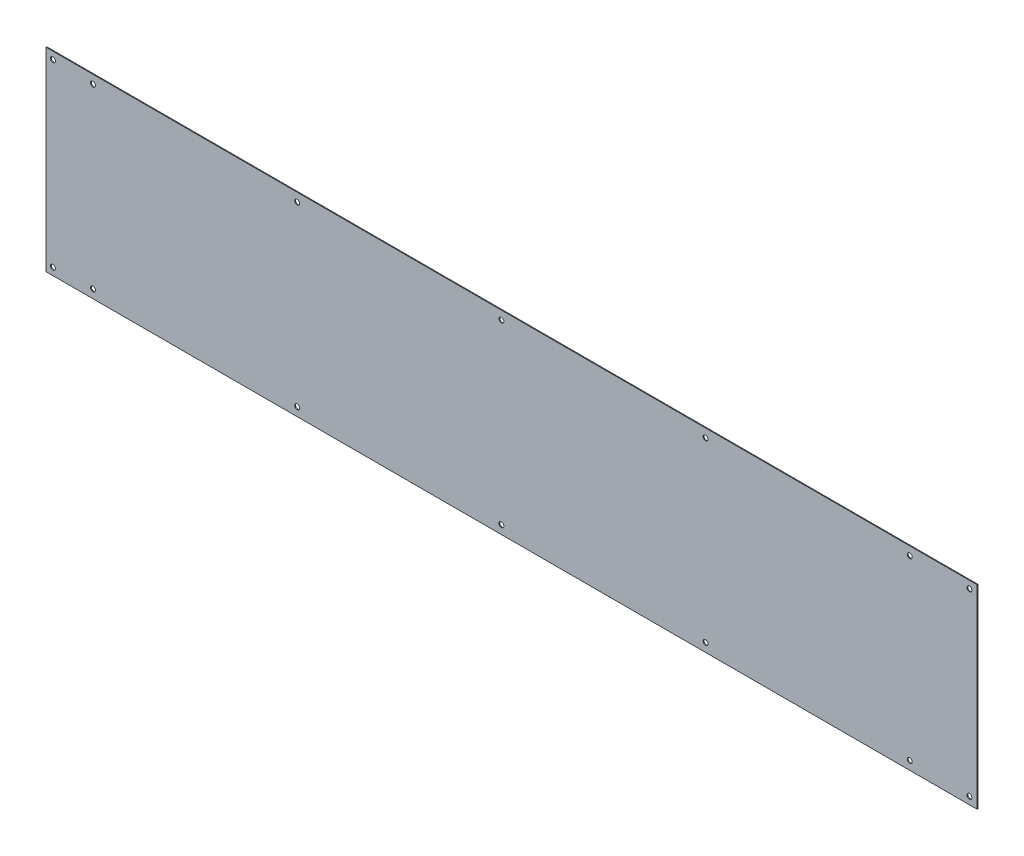
ISO-10303-21;
HEADER;
FILE_DESCRIPTION(('STEP AP214'),'2;1');
FILE_NAME('part.step','',(''),(''),'','','');
FILE_SCHEMA(('AUTOMOTIVE_DESIGN { 1 0 10303 214 1 1 1 1 }'));
ENDSEC;
DATA;
#1=APPLICATION_CONTEXT('core data for automotive mechanical design processes');
#2=APPLICATION_PROTOCOL_DEFINITION('international standard','automotive_design',2000,#1);
#3=PRODUCT_CONTEXT('',#1,'mechanical');
#4=PRODUCT('Part','Part','',(#3));
#5=PRODUCT_RELATED_PRODUCT_CATEGORY('part','',(#4));
#6=PRODUCT_DEFINITION_FORMATION('','',#4);
#7=PRODUCT_DEFINITION_CONTEXT('part definition',#1,'design');
#8=PRODUCT_DEFINITION('design','',#6,#7);
#9=PRODUCT_DEFINITION_SHAPE('','',#8);
#10=(LENGTH_UNIT() NAMED_UNIT(*) SI_UNIT(.MILLI.,.METRE.));
#11=(NAMED_UNIT(*) PLANE_ANGLE_UNIT() SI_UNIT($,.RADIAN.));
#12=(NAMED_UNIT(*) SI_UNIT($,.STERADIAN.) SOLID_ANGLE_UNIT());
#13=UNCERTAINTY_MEASURE_WITH_UNIT(LENGTH_MEASURE(1.E-05),#10,'distance_accuracy_value','');
#14=(GEOMETRIC_REPRESENTATION_CONTEXT(3) GLOBAL_UNCERTAINTY_ASSIGNED_CONTEXT((#13)) GLOBAL_UNIT_ASSIGNED_CONTEXT((#10,
#11,#12)) REPRESENTATION_CONTEXT('',''));
#15=CARTESIAN_POINT('',(0.,0.,0.));
#16=DIRECTION('',(0.,0.,1.));
#17=DIRECTION('',(1.,0.,0.));
#18=AXIS2_PLACEMENT_3D('',#15,#16,#17);
#19=CARTESIAN_POINT('',(570.,119.,-1.));
#20=DIRECTION('',(1.,0.,0.));
#21=DIRECTION('',(0.,0.,-1.));
#22=AXIS2_PLACEMENT_3D('',#19,#20,#21);
#23=PLANE('',#22);
#24=DIRECTION('',(0.,1.,0.));
#25=VECTOR('',#24,1.);
#26=CARTESIAN_POINT('',(570.,119.,0.));
#27=LINE('',#26,#25);
#28=CARTESIAN_POINT('',(570.,-119.,0.));
#29=VERTEX_POINT('',#28);
#30=CARTESIAN_POINT('',(570.,119.,0.));
#31=VERTEX_POINT('',#30);
#32=EDGE_CURVE('E99',#29,#31,#27,.T.);
#33=ORIENTED_EDGE('',*,*,#32,.F.);
#34=DIRECTION('',(0.,0.,1.));
#35=VECTOR('',#34,1.);
#36=CARTESIAN_POINT('',(570.,-119.,-1.));
#37=LINE('',#36,#35);
#38=CARTESIAN_POINT('',(570.,-119.,-1.));
#39=VERTEX_POINT('',#38);
#40=EDGE_CURVE('E11',#39,#29,#37,.T.);
#41=ORIENTED_EDGE('',*,*,#40,.F.);
#42=DIRECTION('',(0.,1.,0.));
#43=VECTOR('',#42,1.);
#44=CARTESIAN_POINT('',(570.,119.,-1.));
#45=LINE('',#44,#43);
#46=CARTESIAN_POINT('',(570.,119.,-1.));
#47=VERTEX_POINT('',#46);
#48=EDGE_CURVE('E92',#39,#47,#45,.T.);
#49=ORIENTED_EDGE('',*,*,#48,.T.);
#50=DIRECTION('',(0.,0.,1.));
#51=VECTOR('',#50,1.);
#52=CARTESIAN_POINT('',(570.,119.,-1.));
#53=LINE('',#52,#51);
#54=EDGE_CURVE('E37',#47,#31,#53,.T.);
#55=ORIENTED_EDGE('',*,*,#54,.T.);
#56=EDGE_LOOP('',(#33,#41,#49,#55));
#57=FACE_BOUND('',#56,.T.);
#58=ADVANCED_FACE('F34',(#57),#23,.T.);
#59=CARTESIAN_POINT('',(-570.,-119.,-1.));
#60=DIRECTION('',(0.,-1.,0.));
#61=DIRECTION('',(0.,0.,-1.));
#62=AXIS2_PLACEMENT_3D('',#59,#60,#61);
#63=PLANE('',#62);
#64=DIRECTION('',(1.,0.,0.));
#65=VECTOR('',#64,1.);
#66=CARTESIAN_POINT('',(-570.,-119.,0.));
#67=LINE('',#66,#65);
#68=CARTESIAN_POINT('',(-570.,-119.,0.));
#69=VERTEX_POINT('',#68);
#70=EDGE_CURVE('E94',#69,#29,#67,.T.);
#71=ORIENTED_EDGE('',*,*,#70,.F.);
#72=DIRECTION('',(0.,0.,1.));
#73=VECTOR('',#72,1.);
#74=CARTESIAN_POINT('',(-570.,-119.,-1.));
#75=LINE('',#74,#73);
#76=CARTESIAN_POINT('',(-570.,-119.,-1.));
#77=VERTEX_POINT('',#76);
#78=EDGE_CURVE('E43',#77,#69,#75,.T.);
#79=ORIENTED_EDGE('',*,*,#78,.F.);
#80=DIRECTION('',(1.,0.,0.));
#81=VECTOR('',#80,1.);
#82=CARTESIAN_POINT('',(-570.,-119.,-1.));
#83=LINE('',#82,#81);
#84=EDGE_CURVE('E89',#77,#39,#83,.T.);
#85=ORIENTED_EDGE('',*,*,#84,.T.);
#86=ORIENTED_EDGE('',*,*,#40,.T.);
#87=EDGE_LOOP('',(#71,#79,#85,#86));
#88=FACE_BOUND('',#87,.T.);
#89=ADVANCED_FACE('F110',(#88),#63,.T.);
#90=CARTESIAN_POINT('',(-570.,119.,-1.));
#91=DIRECTION('',(-1.,0.,0.));
#92=DIRECTION('',(0.,0.,1.));
#93=AXIS2_PLACEMENT_3D('',#90,#91,#92);
#94=PLANE('',#93);
#95=DIRECTION('',(0.,-1.,0.));
#96=VECTOR('',#95,1.);
#97=CARTESIAN_POINT('',(-570.,119.,0.));
#98=LINE('',#97,#96);
#99=CARTESIAN_POINT('',(-570.,119.,0.));
#100=VERTEX_POINT('',#99);
#101=EDGE_CURVE('E84',#100,#69,#98,.T.);
#102=ORIENTED_EDGE('',*,*,#101,.F.);
#103=DIRECTION('',(0.,0.,1.));
#104=VECTOR('',#103,1.);
#105=CARTESIAN_POINT('',(-570.,119.,-1.));
#106=LINE('',#105,#104);
#107=CARTESIAN_POINT('',(-570.,119.,-1.));
#108=VERTEX_POINT('',#107);
#109=EDGE_CURVE('E79',#108,#100,#106,.T.);
#110=ORIENTED_EDGE('',*,*,#109,.F.);
#111=DIRECTION('',(0.,-1.,0.));
#112=VECTOR('',#111,1.);
#113=CARTESIAN_POINT('',(-570.,119.,-1.));
#114=LINE('',#113,#112);
#115=EDGE_CURVE('E82',#108,#77,#114,.T.);
#116=ORIENTED_EDGE('',*,*,#115,.T.);
#117=ORIENTED_EDGE('',*,*,#78,.T.);
#118=EDGE_LOOP('',(#102,#110,#116,#117));
#119=FACE_BOUND('',#118,.T.);
#120=ADVANCED_FACE('F81',(#119),#94,.T.);
#121=CARTESIAN_POINT('',(-570.,119.,-1.));
#122=DIRECTION('',(0.,1.,0.));
#123=DIRECTION('',(0.,0.,1.));
#124=AXIS2_PLACEMENT_3D('',#121,#122,#123);
#125=PLANE('',#124);
#126=DIRECTION('',(-1.,0.,0.));
#127=VECTOR('',#126,1.);
#128=CARTESIAN_POINT('',(-570.,119.,0.));
#129=LINE('',#128,#127);
#130=EDGE_CURVE('E102',#31,#100,#129,.T.);
#131=ORIENTED_EDGE('',*,*,#130,.F.);
#132=ORIENTED_EDGE('',*,*,#54,.F.);
#133=DIRECTION('',(-1.,0.,0.));
#134=VECTOR('',#133,1.);
#135=CARTESIAN_POINT('',(-570.,119.,-1.));
#136=LINE('',#135,#134);
#137=EDGE_CURVE('E88',#47,#108,#136,.T.);
#138=ORIENTED_EDGE('',*,*,#137,.T.);
#139=ORIENTED_EDGE('',*,*,#109,.T.);
#140=EDGE_LOOP('',(#131,#132,#138,#139));
#141=FACE_BOUND('',#140,.T.);
#142=ADVANCED_FACE('F91',(#141),#125,.T.);
#143=CARTESIAN_POINT('',(570.,-119.,-1.));
#144=DIRECTION('',(0.,0.,1.));
#145=DIRECTION('',(1.,0.,0.));
#146=AXIS2_PLACEMENT_3D('',#143,#144,#145);
#147=PLANE('',#146);
#148=CARTESIAN_POINT('',(487.5,-108.5,-1.));
#149=DIRECTION('',(0.,0.,1.));
#150=DIRECTION('',(1.,0.,0.));
#151=AXIS2_PLACEMENT_3D('',#148,#149,#150);
#152=CIRCLE('',#151,2.99999999999999);
#153=CARTESIAN_POINT('',(490.5,-108.5,-1.));
#154=VERTEX_POINT('',#153);
#155=EDGE_CURVE('E194',#154,#154,#152,.F.);
#156=ORIENTED_EDGE('',*,*,#155,.F.);
#157=EDGE_LOOP('',(#156));
#158=FACE_BOUND('',#157,.T.);
#159=CARTESIAN_POINT('',(237.5,-108.5,-1.));
#160=DIRECTION('',(0.,0.,1.));
#161=DIRECTION('',(1.,0.,0.));
#162=AXIS2_PLACEMENT_3D('',#159,#160,#161);
#163=CIRCLE('',#162,2.99999999999999);
#164=CARTESIAN_POINT('',(240.5,-108.5,-1.));
#165=VERTEX_POINT('',#164);
#166=EDGE_CURVE('E198',#165,#165,#163,.F.);
#167=ORIENTED_EDGE('',*,*,#166,.F.);
#168=EDGE_LOOP('',(#167));
#169=FACE_BOUND('',#168,.T.);
#170=CARTESIAN_POINT('',(-12.5000000000002,-108.5,-1.));
#171=DIRECTION('',(0.,0.,1.));
#172=DIRECTION('',(1.,0.,0.));
#173=AXIS2_PLACEMENT_3D('',#170,#171,#172);
#174=CIRCLE('',#173,3.);
#175=CARTESIAN_POINT('',(-9.50000000000017,-108.5,-1.));
#176=VERTEX_POINT('',#175);
#177=EDGE_CURVE('E207',#176,#176,#174,.F.);
#178=ORIENTED_EDGE('',*,*,#177,.F.);
#179=EDGE_LOOP('',(#178));
#180=FACE_BOUND('',#179,.T.);
#181=CARTESIAN_POINT('',(-262.5,-108.5,-1.));
#182=DIRECTION('',(0.,0.,1.));
#183=DIRECTION('',(1.,0.,0.));
#184=AXIS2_PLACEMENT_3D('',#181,#182,#183);
#185=CIRCLE('',#184,2.99999999999999);
#186=CARTESIAN_POINT('',(-259.5,-108.5,-1.));
#187=VERTEX_POINT('',#186);
#188=EDGE_CURVE('E213',#187,#187,#185,.F.);
#189=ORIENTED_EDGE('',*,*,#188,.F.);
#190=EDGE_LOOP('',(#189));
#191=FACE_BOUND('',#190,.T.);
#192=CARTESIAN_POINT('',(-512.5,-108.5,-1.));
#193=DIRECTION('',(0.,0.,1.));
#194=DIRECTION('',(1.,0.,0.));
#195=AXIS2_PLACEMENT_3D('',#192,#193,#194);
#196=CIRCLE('',#195,3.00000000000005);
#197=CARTESIAN_POINT('',(-509.5,-108.5,-1.));
#198=VERTEX_POINT('',#197);
#199=EDGE_CURVE('E219',#198,#198,#196,.F.);
#200=ORIENTED_EDGE('',*,*,#199,.F.);
#201=EDGE_LOOP('',(#200));
#202=FACE_BOUND('',#201,.T.);
#203=CARTESIAN_POINT('',(487.5,108.5,-1.));
#204=DIRECTION('',(0.,0.,1.));
#205=DIRECTION('',(1.,0.,0.));
#206=AXIS2_PLACEMENT_3D('',#203,#204,#205);
#207=CIRCLE('',#206,2.99999999999999);
#208=CARTESIAN_POINT('',(490.5,108.5,-1.));
#209=VERTEX_POINT('',#208);
#210=EDGE_CURVE('E225',#209,#209,#207,.F.);
#211=ORIENTED_EDGE('',*,*,#210,.F.);
#212=EDGE_LOOP('',(#211));
#213=FACE_BOUND('',#212,.T.);
#214=CARTESIAN_POINT('',(237.5,108.5,-1.));
#215=DIRECTION('',(0.,0.,1.));
#216=DIRECTION('',(1.,0.,0.));
#217=AXIS2_PLACEMENT_3D('',#214,#215,#216);
#218=CIRCLE('',#217,2.99999999999999);
#219=CARTESIAN_POINT('',(240.5,108.5,-1.));
#220=VERTEX_POINT('',#219);
#221=EDGE_CURVE('E231',#220,#220,#218,.F.);
#222=ORIENTED_EDGE('',*,*,#221,.F.);
#223=EDGE_LOOP('',(#222));
#224=FACE_BOUND('',#223,.T.);
#225=CARTESIAN_POINT('',(-12.5000000000002,108.5,-1.));
#226=DIRECTION('',(0.,0.,1.));
#227=DIRECTION('',(1.,0.,0.));
#228=AXIS2_PLACEMENT_3D('',#225,#226,#227);
#229=CIRCLE('',#228,3.);
#230=CARTESIAN_POINT('',(-9.50000000000017,108.5,-1.));
#231=VERTEX_POINT('',#230);
#232=EDGE_CURVE('E237',#231,#231,#229,.F.);
#233=ORIENTED_EDGE('',*,*,#232,.F.);
#234=EDGE_LOOP('',(#233));
#235=FACE_BOUND('',#234,.T.);
#236=CARTESIAN_POINT('',(-262.5,108.5,-1.));
#237=DIRECTION('',(0.,0.,1.));
#238=DIRECTION('',(1.,0.,0.));
#239=AXIS2_PLACEMENT_3D('',#236,#237,#238);
#240=CIRCLE('',#239,2.99999999999999);
#241=CARTESIAN_POINT('',(-259.5,108.5,-1.));
#242=VERTEX_POINT('',#241);
#243=EDGE_CURVE('E243',#242,#242,#240,.F.);
#244=ORIENTED_EDGE('',*,*,#243,.F.);
#245=EDGE_LOOP('',(#244));
#246=FACE_BOUND('',#245,.T.);
#247=CARTESIAN_POINT('',(-512.5,108.5,-1.));
#248=DIRECTION('',(0.,0.,1.));
#249=DIRECTION('',(1.,0.,0.));
#250=AXIS2_PLACEMENT_3D('',#247,#248,#249);
#251=CIRCLE('',#250,3.00000000000005);
#252=CARTESIAN_POINT('',(-509.5,108.5,-1.));
#253=VERTEX_POINT('',#252);
#254=EDGE_CURVE('E249',#253,#253,#251,.F.);
#255=ORIENTED_EDGE('',*,*,#254,.F.);
#256=EDGE_LOOP('',(#255));
#257=FACE_BOUND('',#256,.T.);
#258=CARTESIAN_POINT('',(560.5,-110.,-1.));
#259=DIRECTION('',(0.,0.,1.));
#260=DIRECTION('',(1.,0.,0.));
#261=AXIS2_PLACEMENT_3D('',#258,#259,#260);
#262=CIRCLE('',#261,3.00000000000005);
#263=CARTESIAN_POINT('',(563.5,-110.,-1.));
#264=VERTEX_POINT('',#263);
#265=EDGE_CURVE('E253',#264,#264,#262,.T.);
#266=ORIENTED_EDGE('',*,*,#265,.T.);
#267=EDGE_LOOP('',(#266));
#268=FACE_BOUND('',#267,.T.);
#269=CARTESIAN_POINT('',(560.5,110.,-1.));
#270=DIRECTION('',(0.,0.,1.));
#271=DIRECTION('',(1.,0.,0.));
#272=AXIS2_PLACEMENT_3D('',#269,#270,#271);
#273=CIRCLE('',#272,3.00000000000005);
#274=CARTESIAN_POINT('',(563.5,110.,-1.));
#275=VERTEX_POINT('',#274);
#276=EDGE_CURVE('E259',#275,#275,#273,.T.);
#277=ORIENTED_EDGE('',*,*,#276,.T.);
#278=EDGE_LOOP('',(#277));
#279=FACE_BOUND('',#278,.T.);
#280=CARTESIAN_POINT('',(-561.5,-110.,-1.));
#281=DIRECTION('',(0.,0.,1.));
#282=DIRECTION('',(1.,0.,0.));
#283=AXIS2_PLACEMENT_3D('',#280,#281,#282);
#284=CIRCLE('',#283,3.00000000000005);
#285=CARTESIAN_POINT('',(-558.5,-110.,-1.));
#286=VERTEX_POINT('',#285);
#287=EDGE_CURVE('E265',#286,#286,#284,.T.);
#288=ORIENTED_EDGE('',*,*,#287,.T.);
#289=EDGE_LOOP('',(#288));
#290=FACE_BOUND('',#289,.T.);
#291=CARTESIAN_POINT('',(-561.5,110.,-1.));
#292=DIRECTION('',(0.,0.,1.));
#293=DIRECTION('',(1.,0.,0.));
#294=AXIS2_PLACEMENT_3D('',#291,#292,#293);
#295=CIRCLE('',#294,3.00000000000005);
#296=CARTESIAN_POINT('',(-558.5,110.,-1.));
#297=VERTEX_POINT('',#296);
#298=EDGE_CURVE('E103',#297,#297,#295,.T.);
#299=ORIENTED_EDGE('',*,*,#298,.T.);
#300=EDGE_LOOP('',(#299));
#301=FACE_BOUND('',#300,.T.);
#302=ORIENTED_EDGE('',*,*,#48,.F.);
#303=ORIENTED_EDGE('',*,*,#84,.F.);
#304=ORIENTED_EDGE('',*,*,#115,.F.);
#305=ORIENTED_EDGE('',*,*,#137,.F.);
#306=EDGE_LOOP('',(#302,#303,#304,#305));
#307=FACE_BOUND('',#306,.T.);
#308=ADVANCED_FACE('F87',(#158,#169,#180,#191,#202,#213,#224,#235,#246,#257,#268,#279,#290,#301,
#307),#147,.F.);
#309=CARTESIAN_POINT('',(570.,-119.,0.));
#310=DIRECTION('',(0.,0.,1.));
#311=DIRECTION('',(1.,0.,0.));
#312=AXIS2_PLACEMENT_3D('',#309,#310,#311);
#313=PLANE('',#312);
#314=CARTESIAN_POINT('',(487.5,-108.5,0.));
#315=DIRECTION('',(0.,0.,1.));
#316=DIRECTION('',(1.,0.,0.));
#317=AXIS2_PLACEMENT_3D('',#314,#315,#316);
#318=CIRCLE('',#317,2.99999999999999);
#319=CARTESIAN_POINT('',(490.5,-108.5,0.));
#320=VERTEX_POINT('',#319);
#321=EDGE_CURVE('E192',#320,#320,#318,.T.);
#322=ORIENTED_EDGE('',*,*,#321,.F.);
#323=EDGE_LOOP('',(#322));
#324=FACE_BOUND('',#323,.T.);
#325=CARTESIAN_POINT('',(237.5,-108.5,0.));
#326=DIRECTION('',(0.,0.,1.));
#327=DIRECTION('',(1.,0.,0.));
#328=AXIS2_PLACEMENT_3D('',#325,#326,#327);
#329=CIRCLE('',#328,2.99999999999999);
#330=CARTESIAN_POINT('',(240.5,-108.5,0.));
#331=VERTEX_POINT('',#330);
#332=EDGE_CURVE('E195',#331,#331,#329,.T.);
#333=ORIENTED_EDGE('',*,*,#332,.F.);
#334=EDGE_LOOP('',(#333));
#335=FACE_BOUND('',#334,.T.);
#336=CARTESIAN_POINT('',(-12.5000000000002,-108.5,0.));
#337=DIRECTION('',(0.,0.,1.));
#338=DIRECTION('',(1.,0.,0.));
#339=AXIS2_PLACEMENT_3D('',#336,#337,#338);
#340=CIRCLE('',#339,3.);
#341=CARTESIAN_POINT('',(-9.50000000000017,-108.5,0.));
#342=VERTEX_POINT('',#341);
#343=EDGE_CURVE('E204',#342,#342,#340,.T.);
#344=ORIENTED_EDGE('',*,*,#343,.F.);
#345=EDGE_LOOP('',(#344));
#346=FACE_BOUND('',#345,.T.);
#347=CARTESIAN_POINT('',(-262.5,-108.5,0.));
#348=DIRECTION('',(0.,0.,1.));
#349=DIRECTION('',(1.,0.,0.));
#350=AXIS2_PLACEMENT_3D('',#347,#348,#349);
#351=CIRCLE('',#350,2.99999999999999);
#352=CARTESIAN_POINT('',(-259.5,-108.5,0.));
#353=VERTEX_POINT('',#352);
#354=EDGE_CURVE('E210',#353,#353,#351,.T.);
#355=ORIENTED_EDGE('',*,*,#354,.F.);
#356=EDGE_LOOP('',(#355));
#357=FACE_BOUND('',#356,.T.);
#358=CARTESIAN_POINT('',(-512.5,-108.5,0.));
#359=DIRECTION('',(0.,0.,1.));
#360=DIRECTION('',(1.,0.,0.));
#361=AXIS2_PLACEMENT_3D('',#358,#359,#360);
#362=CIRCLE('',#361,3.00000000000005);
#363=CARTESIAN_POINT('',(-509.5,-108.5,0.));
#364=VERTEX_POINT('',#363);
#365=EDGE_CURVE('E216',#364,#364,#362,.T.);
#366=ORIENTED_EDGE('',*,*,#365,.F.);
#367=EDGE_LOOP('',(#366));
#368=FACE_BOUND('',#367,.T.);
#369=CARTESIAN_POINT('',(487.5,108.5,0.));
#370=DIRECTION('',(0.,0.,1.));
#371=DIRECTION('',(1.,0.,0.));
#372=AXIS2_PLACEMENT_3D('',#369,#370,#371);
#373=CIRCLE('',#372,2.99999999999999);
#374=CARTESIAN_POINT('',(490.5,108.5,0.));
#375=VERTEX_POINT('',#374);
#376=EDGE_CURVE('E222',#375,#375,#373,.T.);
#377=ORIENTED_EDGE('',*,*,#376,.F.);
#378=EDGE_LOOP('',(#377));
#379=FACE_BOUND('',#378,.T.);
#380=CARTESIAN_POINT('',(237.5,108.5,0.));
#381=DIRECTION('',(0.,0.,1.));
#382=DIRECTION('',(1.,0.,0.));
#383=AXIS2_PLACEMENT_3D('',#380,#381,#382);
#384=CIRCLE('',#383,2.99999999999999);
#385=CARTESIAN_POINT('',(240.5,108.5,0.));
#386=VERTEX_POINT('',#385);
#387=EDGE_CURVE('E228',#386,#386,#384,.T.);
#388=ORIENTED_EDGE('',*,*,#387,.F.);
#389=EDGE_LOOP('',(#388));
#390=FACE_BOUND('',#389,.T.);
#391=CARTESIAN_POINT('',(-12.5000000000002,108.5,0.));
#392=DIRECTION('',(0.,0.,1.));
#393=DIRECTION('',(1.,0.,0.));
#394=AXIS2_PLACEMENT_3D('',#391,#392,#393);
#395=CIRCLE('',#394,3.);
#396=CARTESIAN_POINT('',(-9.50000000000017,108.5,0.));
#397=VERTEX_POINT('',#396);
#398=EDGE_CURVE('E234',#397,#397,#395,.T.);
#399=ORIENTED_EDGE('',*,*,#398,.F.);
#400=EDGE_LOOP('',(#399));
#401=FACE_BOUND('',#400,.T.);
#402=CARTESIAN_POINT('',(-262.5,108.5,0.));
#403=DIRECTION('',(0.,0.,1.));
#404=DIRECTION('',(1.,0.,0.));
#405=AXIS2_PLACEMENT_3D('',#402,#403,#404);
#406=CIRCLE('',#405,2.99999999999999);
#407=CARTESIAN_POINT('',(-259.5,108.5,0.));
#408=VERTEX_POINT('',#407);
#409=EDGE_CURVE('E240',#408,#408,#406,.T.);
#410=ORIENTED_EDGE('',*,*,#409,.F.);
#411=EDGE_LOOP('',(#410));
#412=FACE_BOUND('',#411,.T.);
#413=CARTESIAN_POINT('',(-512.5,108.5,0.));
#414=DIRECTION('',(0.,0.,1.));
#415=DIRECTION('',(1.,0.,0.));
#416=AXIS2_PLACEMENT_3D('',#413,#414,#415);
#417=CIRCLE('',#416,3.00000000000005);
#418=CARTESIAN_POINT('',(-509.5,108.5,0.));
#419=VERTEX_POINT('',#418);
#420=EDGE_CURVE('E246',#419,#419,#417,.T.);
#421=ORIENTED_EDGE('',*,*,#420,.F.);
#422=EDGE_LOOP('',(#421));
#423=FACE_BOUND('',#422,.T.);
#424=CARTESIAN_POINT('',(560.5,-110.,0.));
#425=DIRECTION('',(0.,0.,1.));
#426=DIRECTION('',(1.,0.,0.));
#427=AXIS2_PLACEMENT_3D('',#424,#425,#426);
#428=CIRCLE('',#427,3.00000000000005);
#429=CARTESIAN_POINT('',(563.5,-110.,0.));
#430=VERTEX_POINT('',#429);
#431=EDGE_CURVE('E252',#430,#430,#428,.T.);
#432=ORIENTED_EDGE('',*,*,#431,.F.);
#433=EDGE_LOOP('',(#432));
#434=FACE_BOUND('',#433,.T.);
#435=CARTESIAN_POINT('',(560.5,110.,0.));
#436=DIRECTION('',(0.,0.,1.));
#437=DIRECTION('',(1.,0.,0.));
#438=AXIS2_PLACEMENT_3D('',#435,#436,#437);
#439=CIRCLE('',#438,3.00000000000005);
#440=CARTESIAN_POINT('',(563.5,110.,0.));
#441=VERTEX_POINT('',#440);
#442=EDGE_CURVE('E256',#441,#441,#439,.T.);
#443=ORIENTED_EDGE('',*,*,#442,.F.);
#444=EDGE_LOOP('',(#443));
#445=FACE_BOUND('',#444,.T.);
#446=CARTESIAN_POINT('',(-561.5,-110.,0.));
#447=DIRECTION('',(0.,0.,1.));
#448=DIRECTION('',(1.,0.,0.));
#449=AXIS2_PLACEMENT_3D('',#446,#447,#448);
#450=CIRCLE('',#449,3.00000000000005);
#451=CARTESIAN_POINT('',(-558.5,-110.,0.));
#452=VERTEX_POINT('',#451);
#453=EDGE_CURVE('E262',#452,#452,#450,.T.);
#454=ORIENTED_EDGE('',*,*,#453,.F.);
#455=EDGE_LOOP('',(#454));
#456=FACE_BOUND('',#455,.T.);
#457=CARTESIAN_POINT('',(-561.5,110.,0.));
#458=DIRECTION('',(0.,0.,1.));
#459=DIRECTION('',(1.,0.,0.));
#460=AXIS2_PLACEMENT_3D('',#457,#458,#459);
#461=CIRCLE('',#460,3.00000000000005);
#462=CARTESIAN_POINT('',(-558.5,110.,0.));
#463=VERTEX_POINT('',#462);
#464=EDGE_CURVE('E268',#463,#463,#461,.T.);
#465=ORIENTED_EDGE('',*,*,#464,.F.);
#466=EDGE_LOOP('',(#465));
#467=FACE_BOUND('',#466,.T.);
#468=ORIENTED_EDGE('',*,*,#32,.T.);
#469=ORIENTED_EDGE('',*,*,#130,.T.);
#470=ORIENTED_EDGE('',*,*,#101,.T.);
#471=ORIENTED_EDGE('',*,*,#70,.T.);
#472=EDGE_LOOP('',(#468,#469,#470,#471));
#473=FACE_BOUND('',#472,.T.);
#474=ADVANCED_FACE('F109',(#324,#335,#346,#357,#368,#379,#390,#401,#412,#423,#434,#445,#456,
#467,#473),#313,.T.);
#475=CARTESIAN_POINT('',(-561.5,110.,-1.));
#476=DIRECTION('',(0.,0.,1.));
#477=DIRECTION('',(1.,0.,0.));
#478=AXIS2_PLACEMENT_3D('',#475,#476,#477);
#479=CYLINDRICAL_SURFACE('',#478,3.00000000000005);
#480=ORIENTED_EDGE('',*,*,#298,.F.);
#481=EDGE_LOOP('',(#480));
#482=FACE_BOUND('',#481,.T.);
#483=ORIENTED_EDGE('',*,*,#464,.T.);
#484=EDGE_LOOP('',(#483));
#485=FACE_BOUND('',#484,.T.);
#486=ADVANCED_FACE('F128',(#482,#485),#479,.F.);
#487=CARTESIAN_POINT('',(-561.5,-110.,-1.));
#488=DIRECTION('',(0.,0.,1.));
#489=DIRECTION('',(1.,0.,0.));
#490=AXIS2_PLACEMENT_3D('',#487,#488,#489);
#491=CYLINDRICAL_SURFACE('',#490,3.00000000000005);
#492=ORIENTED_EDGE('',*,*,#287,.F.);
#493=EDGE_LOOP('',(#492));
#494=FACE_BOUND('',#493,.T.);
#495=ORIENTED_EDGE('',*,*,#453,.T.);
#496=EDGE_LOOP('',(#495));
#497=FACE_BOUND('',#496,.T.);
#498=ADVANCED_FACE('F135',(#494,#497),#491,.F.);
#499=CARTESIAN_POINT('',(560.5,110.,-1.));
#500=DIRECTION('',(0.,0.,1.));
#501=DIRECTION('',(1.,0.,0.));
#502=AXIS2_PLACEMENT_3D('',#499,#500,#501);
#503=CYLINDRICAL_SURFACE('',#502,3.00000000000005);
#504=ORIENTED_EDGE('',*,*,#276,.F.);
#505=EDGE_LOOP('',(#504));
#506=FACE_BOUND('',#505,.T.);
#507=ORIENTED_EDGE('',*,*,#442,.T.);
#508=EDGE_LOOP('',(#507));
#509=FACE_BOUND('',#508,.T.);
#510=ADVANCED_FACE('F139',(#506,#509),#503,.F.);
#511=CARTESIAN_POINT('',(560.5,-110.,-1.));
#512=DIRECTION('',(0.,0.,1.));
#513=DIRECTION('',(1.,0.,0.));
#514=AXIS2_PLACEMENT_3D('',#511,#512,#513);
#515=CYLINDRICAL_SURFACE('',#514,3.00000000000005);
#516=ORIENTED_EDGE('',*,*,#265,.F.);
#517=EDGE_LOOP('',(#516));
#518=FACE_BOUND('',#517,.T.);
#519=ORIENTED_EDGE('',*,*,#431,.T.);
#520=EDGE_LOOP('',(#519));
#521=FACE_BOUND('',#520,.T.);
#522=ADVANCED_FACE('F143',(#518,#521),#515,.F.);
#523=CARTESIAN_POINT('',(-512.5,108.5,-1.001));
#524=DIRECTION('',(0.,0.,1.));
#525=DIRECTION('',(1.,0.,0.));
#526=AXIS2_PLACEMENT_3D('',#523,#524,#525);
#527=CYLINDRICAL_SURFACE('',#526,3.00000000000005);
#528=ORIENTED_EDGE('',*,*,#420,.T.);
#529=EDGE_LOOP('',(#528));
#530=FACE_BOUND('',#529,.T.);
#531=ORIENTED_EDGE('',*,*,#254,.T.);
#532=EDGE_LOOP('',(#531));
#533=FACE_BOUND('',#532,.T.);
#534=ADVANCED_FACE('F147',(#530,#533),#527,.F.);
#535=CARTESIAN_POINT('',(-262.5,108.5,-1.001));
#536=DIRECTION('',(0.,0.,1.));
#537=DIRECTION('',(1.,0.,0.));
#538=AXIS2_PLACEMENT_3D('',#535,#536,#537);
#539=CYLINDRICAL_SURFACE('',#538,2.99999999999999);
#540=ORIENTED_EDGE('',*,*,#409,.T.);
#541=EDGE_LOOP('',(#540));
#542=FACE_BOUND('',#541,.T.);
#543=ORIENTED_EDGE('',*,*,#243,.T.);
#544=EDGE_LOOP('',(#543));
#545=FACE_BOUND('',#544,.T.);
#546=ADVANCED_FACE('F151',(#542,#545),#539,.F.);
#547=CARTESIAN_POINT('',(-12.5000000000002,108.5,-1.001));
#548=DIRECTION('',(0.,0.,1.));
#549=DIRECTION('',(1.,0.,0.));
#550=AXIS2_PLACEMENT_3D('',#547,#548,#549);
#551=CYLINDRICAL_SURFACE('',#550,3.);
#552=ORIENTED_EDGE('',*,*,#398,.T.);
#553=EDGE_LOOP('',(#552));
#554=FACE_BOUND('',#553,.T.);
#555=ORIENTED_EDGE('',*,*,#232,.T.);
#556=EDGE_LOOP('',(#555));
#557=FACE_BOUND('',#556,.T.);
#558=ADVANCED_FACE('F155',(#554,#557),#551,.F.);
#559=CARTESIAN_POINT('',(237.5,108.5,-1.001));
#560=DIRECTION('',(0.,0.,1.));
#561=DIRECTION('',(1.,0.,0.));
#562=AXIS2_PLACEMENT_3D('',#559,#560,#561);
#563=CYLINDRICAL_SURFACE('',#562,2.99999999999999);
#564=ORIENTED_EDGE('',*,*,#387,.T.);
#565=EDGE_LOOP('',(#564));
#566=FACE_BOUND('',#565,.T.);
#567=ORIENTED_EDGE('',*,*,#221,.T.);
#568=EDGE_LOOP('',(#567));
#569=FACE_BOUND('',#568,.T.);
#570=ADVANCED_FACE('F159',(#566,#569),#563,.F.);
#571=CARTESIAN_POINT('',(487.5,108.5,-1.001));
#572=DIRECTION('',(0.,0.,1.));
#573=DIRECTION('',(1.,0.,0.));
#574=AXIS2_PLACEMENT_3D('',#571,#572,#573);
#575=CYLINDRICAL_SURFACE('',#574,2.99999999999999);
#576=ORIENTED_EDGE('',*,*,#376,.T.);
#577=EDGE_LOOP('',(#576));
#578=FACE_BOUND('',#577,.T.);
#579=ORIENTED_EDGE('',*,*,#210,.T.);
#580=EDGE_LOOP('',(#579));
#581=FACE_BOUND('',#580,.T.);
#582=ADVANCED_FACE('F163',(#578,#581),#575,.F.);
#583=CARTESIAN_POINT('',(-512.5,-108.5,-1.001));
#584=DIRECTION('',(0.,0.,1.));
#585=DIRECTION('',(1.,0.,0.));
#586=AXIS2_PLACEMENT_3D('',#583,#584,#585);
#587=CYLINDRICAL_SURFACE('',#586,3.00000000000005);
#588=ORIENTED_EDGE('',*,*,#365,.T.);
#589=EDGE_LOOP('',(#588));
#590=FACE_BOUND('',#589,.T.);
#591=ORIENTED_EDGE('',*,*,#199,.T.);
#592=EDGE_LOOP('',(#591));
#593=FACE_BOUND('',#592,.T.);
#594=ADVANCED_FACE('F167',(#590,#593),#587,.F.);
#595=CARTESIAN_POINT('',(-262.5,-108.5,-1.001));
#596=DIRECTION('',(0.,0.,1.));
#597=DIRECTION('',(1.,0.,0.));
#598=AXIS2_PLACEMENT_3D('',#595,#596,#597);
#599=CYLINDRICAL_SURFACE('',#598,2.99999999999999);
#600=ORIENTED_EDGE('',*,*,#354,.T.);
#601=EDGE_LOOP('',(#600));
#602=FACE_BOUND('',#601,.T.);
#603=ORIENTED_EDGE('',*,*,#188,.T.);
#604=EDGE_LOOP('',(#603));
#605=FACE_BOUND('',#604,.T.);
#606=ADVANCED_FACE('F171',(#602,#605),#599,.F.);
#607=CARTESIAN_POINT('',(-12.5000000000002,-108.5,-1.001));
#608=DIRECTION('',(0.,0.,1.));
#609=DIRECTION('',(1.,0.,0.));
#610=AXIS2_PLACEMENT_3D('',#607,#608,#609);
#611=CYLINDRICAL_SURFACE('',#610,3.);
#612=ORIENTED_EDGE('',*,*,#343,.T.);
#613=EDGE_LOOP('',(#612));
#614=FACE_BOUND('',#613,.T.);
#615=ORIENTED_EDGE('',*,*,#177,.T.);
#616=EDGE_LOOP('',(#615));
#617=FACE_BOUND('',#616,.T.);
#618=ADVANCED_FACE('F175',(#614,#617),#611,.F.);
#619=CARTESIAN_POINT('',(237.5,-108.5,-1.001));
#620=DIRECTION('',(0.,0.,1.));
#621=DIRECTION('',(1.,0.,0.));
#622=AXIS2_PLACEMENT_3D('',#619,#620,#621);
#623=CYLINDRICAL_SURFACE('',#622,2.99999999999999);
#624=ORIENTED_EDGE('',*,*,#332,.T.);
#625=EDGE_LOOP('',(#624));
#626=FACE_BOUND('',#625,.T.);
#627=ORIENTED_EDGE('',*,*,#166,.T.);
#628=EDGE_LOOP('',(#627));
#629=FACE_BOUND('',#628,.T.);
#630=ADVANCED_FACE('F179',(#626,#629),#623,.F.);
#631=CARTESIAN_POINT('',(487.5,-108.5,-1.001));
#632=DIRECTION('',(0.,0.,1.));
#633=DIRECTION('',(1.,0.,0.));
#634=AXIS2_PLACEMENT_3D('',#631,#632,#633);
#635=CYLINDRICAL_SURFACE('',#634,2.99999999999999);
#636=ORIENTED_EDGE('',*,*,#321,.T.);
#637=EDGE_LOOP('',(#636));
#638=FACE_BOUND('',#637,.T.);
#639=ORIENTED_EDGE('',*,*,#155,.T.);
#640=EDGE_LOOP('',(#639));
#641=FACE_BOUND('',#640,.T.);
#642=ADVANCED_FACE('F183',(#638,#641),#635,.F.);
#643=CLOSED_SHELL('',(#58,#89,#120,#142,#308,#474,#486,#498,#510,#522,#534,#546,#558,#570,#582,
#594,#606,#618,#630,#642));
#644=MANIFOLD_SOLID_BREP('B2',#643);
#645=ADVANCED_BREP_SHAPE_REPRESENTATION('',(#18,#644),#14);
#646=SHAPE_DEFINITION_REPRESENTATION(#9,#645);
ENDSEC;
END-ISO-10303-21;
